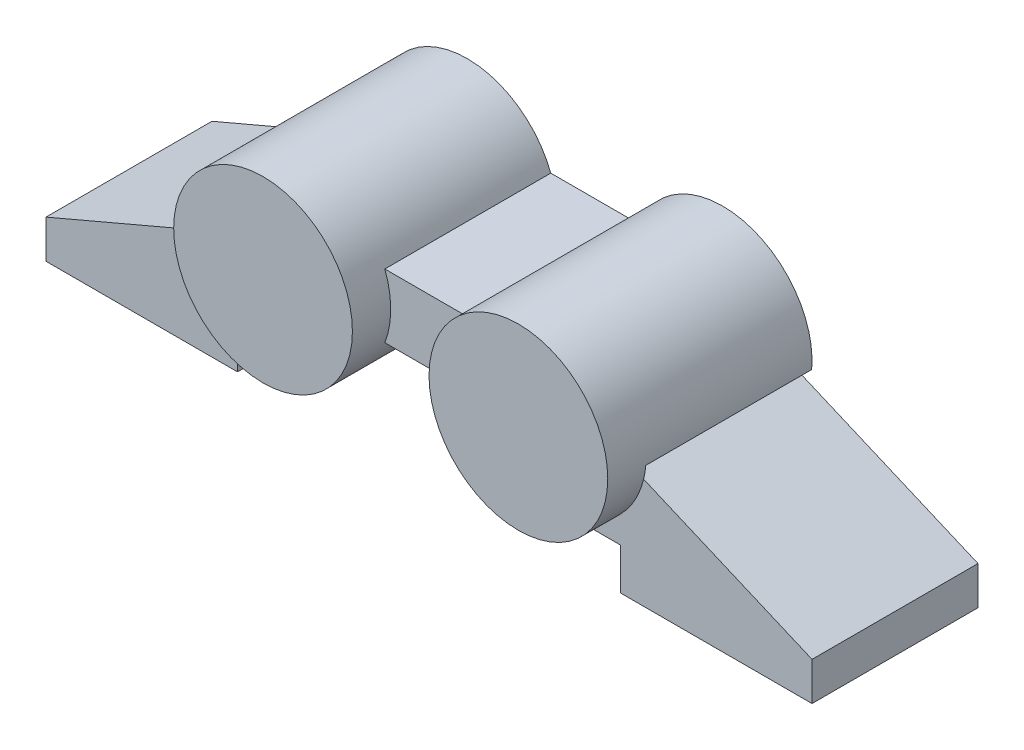
ISO-10303-21;
HEADER;
FILE_DESCRIPTION(('STEP AP214'),'2;1');
FILE_NAME('part.step','',(''),(''),'','','');
FILE_SCHEMA(('AUTOMOTIVE_DESIGN { 1 0 10303 214 1 1 1 1 }'));
ENDSEC;
DATA;
#1=APPLICATION_CONTEXT('core data for automotive mechanical design processes');
#2=APPLICATION_PROTOCOL_DEFINITION('international standard','automotive_design',2000,#1);
#3=PRODUCT_CONTEXT('',#1,'mechanical');
#4=PRODUCT('Part','Part','',(#3));
#5=PRODUCT_RELATED_PRODUCT_CATEGORY('part','',(#4));
#6=PRODUCT_DEFINITION_FORMATION('','',#4);
#7=PRODUCT_DEFINITION_CONTEXT('part definition',#1,'design');
#8=PRODUCT_DEFINITION('design','',#6,#7);
#9=PRODUCT_DEFINITION_SHAPE('','',#8);
#10=(LENGTH_UNIT() NAMED_UNIT(*) SI_UNIT(.MILLI.,.METRE.));
#11=(NAMED_UNIT(*) PLANE_ANGLE_UNIT() SI_UNIT($,.RADIAN.));
#12=(NAMED_UNIT(*) SI_UNIT($,.STERADIAN.) SOLID_ANGLE_UNIT());
#13=UNCERTAINTY_MEASURE_WITH_UNIT(LENGTH_MEASURE(1.E-05),#10,'distance_accuracy_value','');
#14=(GEOMETRIC_REPRESENTATION_CONTEXT(3) GLOBAL_UNCERTAINTY_ASSIGNED_CONTEXT((#13)) GLOBAL_UNIT_ASSIGNED_CONTEXT((#10,
#11,#12)) REPRESENTATION_CONTEXT('',''));
#15=CARTESIAN_POINT('',(0.,0.,0.));
#16=DIRECTION('',(0.,0.,1.));
#17=DIRECTION('',(1.,0.,0.));
#18=AXIS2_PLACEMENT_3D('',#15,#16,#17);
#19=CARTESIAN_POINT('',(10.,-7.5,13.));
#20=DIRECTION('',(0.,0.,-1.));
#21=DIRECTION('',(-1.,0.,0.));
#22=AXIS2_PLACEMENT_3D('',#19,#20,#21);
#23=CYLINDRICAL_SURFACE('',#22,7.);
#24=CARTESIAN_POINT('',(10.,-7.5,16.));
#25=DIRECTION('',(0.,0.,1.));
#26=DIRECTION('',(1.,0.,0.));
#27=AXIS2_PLACEMENT_3D('',#24,#25,#26);
#28=CIRCLE('',#27,7.);
#29=CARTESIAN_POINT('',(17.,-7.5,16.));
#30=VERTEX_POINT('',#29);
#31=EDGE_CURVE('E139',#30,#30,#28,.T.);
#32=ORIENTED_EDGE('',*,*,#31,.F.);
#33=EDGE_LOOP('',(#32));
#34=FACE_BOUND('',#33,.T.);
#35=DIRECTION('',(0.,0.,-1.));
#36=VECTOR('',#35,1.);
#37=CARTESIAN_POINT('',(16.9735909380194,-8.10747792484496,13.));
#38=LINE('',#37,#36);
#39=CARTESIAN_POINT('',(16.9735909380194,-8.10747792484496,0.));
#40=VERTEX_POINT('',#39);
#41=CARTESIAN_POINT('',(16.9735909380194,-8.10747792484496,13.));
#42=VERTEX_POINT('',#41);
#43=EDGE_CURVE('E180',#40,#42,#38,.F.);
#44=ORIENTED_EDGE('',*,*,#43,.F.);
#45=CARTESIAN_POINT('',(10.,-7.5,0.));
#46=DIRECTION('',(0.,0.,1.));
#47=DIRECTION('',(1.,0.,0.));
#48=AXIS2_PLACEMENT_3D('',#45,#46,#47);
#49=CIRCLE('',#48,7.);
#50=CARTESIAN_POINT('',(3.46165158468899,-5.,0.));
#51=VERTEX_POINT('',#50);
#52=EDGE_CURVE('E138',#40,#51,#49,.T.);
#53=ORIENTED_EDGE('',*,*,#52,.T.);
#54=DIRECTION('',(0.,0.,-1.));
#55=VECTOR('',#54,1.);
#56=CARTESIAN_POINT('',(3.46165158468899,-5.,13.));
#57=LINE('',#56,#55);
#58=CARTESIAN_POINT('',(3.46165158468899,-5.,13.));
#59=VERTEX_POINT('',#58);
#60=EDGE_CURVE('E162',#59,#51,#57,.T.);
#61=ORIENTED_EDGE('',*,*,#60,.F.);
#62=CARTESIAN_POINT('',(10.,-7.5,13.));
#63=DIRECTION('',(0.,0.,1.));
#64=DIRECTION('',(1.,0.,0.));
#65=AXIS2_PLACEMENT_3D('',#62,#63,#64);
#66=CIRCLE('',#65,7.);
#67=CARTESIAN_POINT('',(3.46165158468899,-10.,13.));
#68=VERTEX_POINT('',#67);
#69=EDGE_CURVE('E173',#59,#68,#66,.T.);
#70=ORIENTED_EDGE('',*,*,#69,.T.);
#71=DIRECTION('',(0.,0.,-1.));
#72=VECTOR('',#71,1.);
#73=CARTESIAN_POINT('',(3.46165158468899,-10.,13.));
#74=LINE('',#73,#72);
#75=CARTESIAN_POINT('',(3.46165158468899,-10.,0.));
#76=VERTEX_POINT('',#75);
#77=EDGE_CURVE('E96',#68,#76,#74,.T.);
#78=ORIENTED_EDGE('',*,*,#77,.T.);
#79=CARTESIAN_POINT('',(10.,-14.5,0.));
#80=VERTEX_POINT('',#79);
#81=EDGE_CURVE('E142',#76,#80,#49,.T.);
#82=ORIENTED_EDGE('',*,*,#81,.T.);
#83=DIRECTION('',(0.,0.,-1.));
#84=VECTOR('',#83,1.);
#85=CARTESIAN_POINT('',(10.,-14.5,13.));
#86=LINE('',#85,#84);
#87=CARTESIAN_POINT('',(10.,-14.5,13.));
#88=VERTEX_POINT('',#87);
#89=EDGE_CURVE('E158',#88,#80,#86,.T.);
#90=ORIENTED_EDGE('',*,*,#89,.F.);
#91=CARTESIAN_POINT('',(16.8089171951131,-9.12439115673941,13.));
#92=VERTEX_POINT('',#91);
#93=EDGE_CURVE('E164',#88,#92,#66,.T.);
#94=ORIENTED_EDGE('',*,*,#93,.T.);
#95=CARTESIAN_POINT('',(10.,-7.5,13.));
#96=DIRECTION('',(0.,0.,1.));
#97=DIRECTION('',(1.,0.,0.));
#98=AXIS2_PLACEMENT_3D('',#95,#96,#97);
#99=CIRCLE('',#98,7.);
#100=EDGE_CURVE('E11',#92,#42,#99,.T.);
#101=ORIENTED_EDGE('',*,*,#100,.T.);
#102=EDGE_LOOP('',(#44,#53,#61,#70,#78,#82,#90,#94,#101));
#103=FACE_BOUND('',#102,.T.);
#104=ADVANCED_FACE('F34',(#34,#103),#23,.T.);
#105=CARTESIAN_POINT('',(0.,0.,13.));
#106=DIRECTION('',(0.,0.,1.));
#107=DIRECTION('',(1.,0.,0.));
#108=AXIS2_PLACEMENT_3D('',#105,#106,#107);
#109=PLANE('',#108);
#110=ORIENTED_EDGE('',*,*,#69,.F.);
#111=DIRECTION('',(1.,0.,0.));
#112=VECTOR('',#111,1.);
#113=CARTESIAN_POINT('',(0.,-5.,13.));
#114=LINE('',#113,#112);
#115=CARTESIAN_POINT('',(-3.46165158468899,-5.,13.));
#116=VERTEX_POINT('',#115);
#117=EDGE_CURVE('E379',#116,#59,#114,.T.);
#118=ORIENTED_EDGE('',*,*,#117,.F.);
#119=CARTESIAN_POINT('',(-10.,-7.5,13.));
#120=DIRECTION('',(0.,0.,-1.));
#121=DIRECTION('',(-1.,0.,0.));
#122=AXIS2_PLACEMENT_3D('',#119,#120,#121);
#123=CIRCLE('',#122,7.);
#124=CARTESIAN_POINT('',(-3.46165158468899,-10.,13.));
#125=VERTEX_POINT('',#124);
#126=EDGE_CURVE('E265',#116,#125,#123,.T.);
#127=ORIENTED_EDGE('',*,*,#126,.T.);
#128=DIRECTION('',(-1.,0.,0.));
#129=VECTOR('',#128,1.);
#130=CARTESIAN_POINT('',(0.,-10.,13.));
#131=LINE('',#130,#129);
#132=EDGE_CURVE('E383',#68,#125,#131,.T.);
#133=ORIENTED_EDGE('',*,*,#132,.F.);
#134=EDGE_LOOP('',(#110,#118,#127,#133));
#135=FACE_BOUND('',#134,.T.);
#136=ADVANCED_FACE('F386',(#135),#109,.T.);
#137=CARTESIAN_POINT('',(-0.705763952424521,-1.65489478499543,13.));
#138=DIRECTION('',(-0.392286095348589,-0.919843258058762,0.));
#139=DIRECTION('',(0.919843258058762,-0.392286095348589,0.));
#140=AXIS2_PLACEMENT_3D('',#137,#138,#139);
#141=PLANE('',#140);
#142=DIRECTION('',(-0.919843258058762,0.392286095348589,0.));
#143=VECTOR('',#142,1.);
#144=CARTESIAN_POINT('',(-0.705763952424521,-1.65489478499543,0.));
#145=LINE('',#144,#143);
#146=CARTESIAN_POINT('',(30.,-14.75,0.));
#147=VERTEX_POINT('',#146);
#148=CARTESIAN_POINT('',(13.,-7.5,0.));
#149=VERTEX_POINT('',#148);
#150=EDGE_CURVE('E135',#147,#149,#145,.T.);
#151=ORIENTED_EDGE('',*,*,#150,.T.);
#152=DIRECTION('',(0.,0.,-1.));
#153=VECTOR('',#152,1.);
#154=CARTESIAN_POINT('',(13.,-7.5,13.));
#155=LINE('',#154,#153);
#156=CARTESIAN_POINT('',(13.,-7.5,13.));
#157=VERTEX_POINT('',#156);
#158=EDGE_CURVE('E184',#157,#149,#155,.T.);
#159=ORIENTED_EDGE('',*,*,#158,.F.);
#160=DIRECTION('',(-0.919843258058761,0.39228609534859,0.));
#161=VECTOR('',#160,1.);
#162=CARTESIAN_POINT('',(-0.705763952424519,-1.65489478499542,13.));
#163=LINE('',#162,#161);
#164=EDGE_CURVE('E198',#92,#157,#163,.T.);
#165=ORIENTED_EDGE('',*,*,#164,.F.);
#166=DIRECTION('',(-0.919843258058762,0.392286095348589,0.));
#167=VECTOR('',#166,1.);
#168=CARTESIAN_POINT('',(-0.705763952424521,-1.65489478499543,13.));
#169=LINE('',#168,#167);
#170=CARTESIAN_POINT('',(30.,-14.75,13.));
#171=VERTEX_POINT('',#170);
#172=EDGE_CURVE('E154',#171,#92,#169,.T.);
#173=ORIENTED_EDGE('',*,*,#172,.F.);
#174=DIRECTION('',(0.,0.,-1.));
#175=VECTOR('',#174,1.);
#176=CARTESIAN_POINT('',(30.,-14.75,13.));
#177=LINE('',#176,#175);
#178=EDGE_CURVE('E131',#171,#147,#177,.T.);
#179=ORIENTED_EDGE('',*,*,#178,.T.);
#180=EDGE_LOOP('',(#151,#159,#165,#173,#179));
#181=FACE_BOUND('',#180,.T.);
#182=ADVANCED_FACE('F36',(#181),#141,.F.);
#183=CARTESIAN_POINT('',(0.,-5.,13.));
#184=DIRECTION('',(0.,1.,0.));
#185=DIRECTION('',(0.,0.,1.));
#186=AXIS2_PLACEMENT_3D('',#183,#184,#185);
#187=PLANE('',#186);
#188=DIRECTION('',(1.,0.,0.));
#189=VECTOR('',#188,1.);
#190=CARTESIAN_POINT('',(0.,-5.,0.));
#191=LINE('',#190,#189);
#192=CARTESIAN_POINT('',(-3.46165158468899,-5.,0.));
#193=VERTEX_POINT('',#192);
#194=EDGE_CURVE('E141',#193,#51,#191,.T.);
#195=ORIENTED_EDGE('',*,*,#194,.F.);
#196=DIRECTION('',(0.,0.,-1.));
#197=VECTOR('',#196,1.);
#198=CARTESIAN_POINT('',(-3.46165158468899,-5.,13.));
#199=LINE('',#198,#197);
#200=EDGE_CURVE('E209',#116,#193,#199,.T.);
#201=ORIENTED_EDGE('',*,*,#200,.F.);
#202=ORIENTED_EDGE('',*,*,#117,.T.);
#203=ORIENTED_EDGE('',*,*,#60,.T.);
#204=EDGE_LOOP('',(#195,#201,#202,#203));
#205=FACE_BOUND('',#204,.T.);
#206=ADVANCED_FACE('F380',(#205),#187,.T.);
#207=CARTESIAN_POINT('',(0.,-10.,13.));
#208=DIRECTION('',(0.,-1.,0.));
#209=DIRECTION('',(0.,0.,-1.));
#210=AXIS2_PLACEMENT_3D('',#207,#208,#209);
#211=PLANE('',#210);
#212=DIRECTION('',(-1.,0.,0.));
#213=VECTOR('',#212,1.);
#214=CARTESIAN_POINT('',(0.,-10.,0.));
#215=LINE('',#214,#213);
#216=CARTESIAN_POINT('',(-3.46165158468899,-10.,0.));
#217=VERTEX_POINT('',#216);
#218=EDGE_CURVE('E145',#76,#217,#215,.T.);
#219=ORIENTED_EDGE('',*,*,#218,.F.);
#220=ORIENTED_EDGE('',*,*,#77,.F.);
#221=ORIENTED_EDGE('',*,*,#132,.T.);
#222=DIRECTION('',(0.,0.,-1.));
#223=VECTOR('',#222,1.);
#224=CARTESIAN_POINT('',(-3.46165158468899,-10.,13.));
#225=LINE('',#224,#223);
#226=EDGE_CURVE('E212',#125,#217,#225,.T.);
#227=ORIENTED_EDGE('',*,*,#226,.T.);
#228=EDGE_LOOP('',(#219,#220,#221,#227));
#229=FACE_BOUND('',#228,.T.);
#230=ADVANCED_FACE('F402',(#229),#211,.T.);
#231=CARTESIAN_POINT('',(0.,-14.5,13.));
#232=DIRECTION('',(0.,1.,0.));
#233=DIRECTION('',(0.,0.,1.));
#234=AXIS2_PLACEMENT_3D('',#231,#232,#233);
#235=PLANE('',#234);
#236=DIRECTION('',(1.,0.,0.));
#237=VECTOR('',#236,1.);
#238=CARTESIAN_POINT('',(0.,-14.5,0.));
#239=LINE('',#238,#237);
#240=CARTESIAN_POINT('',(15.,-14.5,0.));
#241=VERTEX_POINT('',#240);
#242=EDGE_CURVE('E148',#80,#241,#239,.T.);
#243=ORIENTED_EDGE('',*,*,#242,.T.);
#244=DIRECTION('',(0.,0.,-1.));
#245=VECTOR('',#244,1.);
#246=CARTESIAN_POINT('',(15.,-14.5,13.));
#247=LINE('',#246,#245);
#248=CARTESIAN_POINT('',(15.,-14.5,13.));
#249=VERTEX_POINT('',#248);
#250=EDGE_CURVE('E126',#249,#241,#247,.T.);
#251=ORIENTED_EDGE('',*,*,#250,.F.);
#252=DIRECTION('',(1.,0.,0.));
#253=VECTOR('',#252,1.);
#254=CARTESIAN_POINT('',(0.,-14.5,13.));
#255=LINE('',#254,#253);
#256=EDGE_CURVE('E114',#88,#249,#255,.T.);
#257=ORIENTED_EDGE('',*,*,#256,.F.);
#258=ORIENTED_EDGE('',*,*,#89,.T.);
#259=EDGE_LOOP('',(#243,#251,#257,#258));
#260=FACE_BOUND('',#259,.T.);
#261=ADVANCED_FACE('F406',(#260),#235,.F.);
#262=CARTESIAN_POINT('',(15.,0.,13.));
#263=DIRECTION('',(1.,0.,0.));
#264=DIRECTION('',(0.,0.,-1.));
#265=AXIS2_PLACEMENT_3D('',#262,#263,#264);
#266=PLANE('',#265);
#267=DIRECTION('',(0.,-1.,0.));
#268=VECTOR('',#267,1.);
#269=CARTESIAN_POINT('',(15.,0.,0.));
#270=LINE('',#269,#268);
#271=CARTESIAN_POINT('',(15.,-17.75,0.));
#272=VERTEX_POINT('',#271);
#273=EDGE_CURVE('E123',#241,#272,#270,.T.);
#274=ORIENTED_EDGE('',*,*,#273,.T.);
#275=DIRECTION('',(0.,0.,-1.));
#276=VECTOR('',#275,1.);
#277=CARTESIAN_POINT('',(15.,-17.75,13.));
#278=LINE('',#277,#276);
#279=CARTESIAN_POINT('',(15.,-17.75,13.));
#280=VERTEX_POINT('',#279);
#281=EDGE_CURVE('E120',#280,#272,#278,.T.);
#282=ORIENTED_EDGE('',*,*,#281,.F.);
#283=DIRECTION('',(0.,-1.,0.));
#284=VECTOR('',#283,1.);
#285=CARTESIAN_POINT('',(15.,0.,13.));
#286=LINE('',#285,#284);
#287=EDGE_CURVE('E107',#249,#280,#286,.T.);
#288=ORIENTED_EDGE('',*,*,#287,.F.);
#289=ORIENTED_EDGE('',*,*,#250,.T.);
#290=EDGE_LOOP('',(#274,#282,#288,#289));
#291=FACE_BOUND('',#290,.T.);
#292=ADVANCED_FACE('F121',(#291),#266,.F.);
#293=CARTESIAN_POINT('',(0.,-17.75,13.));
#294=DIRECTION('',(0.,1.,0.));
#295=DIRECTION('',(-1.,0.,0.));
#296=AXIS2_PLACEMENT_3D('',#293,#294,#295);
#297=PLANE('',#296);
#298=DIRECTION('',(1.,0.,0.));
#299=VECTOR('',#298,1.);
#300=CARTESIAN_POINT('',(0.,-17.75,0.));
#301=LINE('',#300,#299);
#302=CARTESIAN_POINT('',(30.,-17.75,0.));
#303=VERTEX_POINT('',#302);
#304=EDGE_CURVE('E151',#272,#303,#301,.T.);
#305=ORIENTED_EDGE('',*,*,#304,.T.);
#306=DIRECTION('',(0.,0.,-1.));
#307=VECTOR('',#306,1.);
#308=CARTESIAN_POINT('',(30.,-17.75,13.));
#309=LINE('',#308,#307);
#310=CARTESIAN_POINT('',(30.,-17.75,13.));
#311=VERTEX_POINT('',#310);
#312=EDGE_CURVE('E127',#311,#303,#309,.T.);
#313=ORIENTED_EDGE('',*,*,#312,.F.);
#314=DIRECTION('',(1.,0.,0.));
#315=VECTOR('',#314,1.);
#316=CARTESIAN_POINT('',(0.,-17.75,13.));
#317=LINE('',#316,#315);
#318=EDGE_CURVE('E111',#280,#311,#317,.T.);
#319=ORIENTED_EDGE('',*,*,#318,.F.);
#320=ORIENTED_EDGE('',*,*,#281,.T.);
#321=EDGE_LOOP('',(#305,#313,#319,#320));
#322=FACE_BOUND('',#321,.T.);
#323=ADVANCED_FACE('F129',(#322),#297,.F.);
#324=CARTESIAN_POINT('',(30.,0.,13.));
#325=DIRECTION('',(-1.,0.,0.));
#326=DIRECTION('',(0.,0.,1.));
#327=AXIS2_PLACEMENT_3D('',#324,#325,#326);
#328=PLANE('',#327);
#329=DIRECTION('',(0.,1.,0.));
#330=VECTOR('',#329,1.);
#331=CARTESIAN_POINT('',(30.,0.,0.));
#332=LINE('',#331,#330);
#333=EDGE_CURVE('E88',#303,#147,#332,.T.);
#334=ORIENTED_EDGE('',*,*,#333,.T.);
#335=ORIENTED_EDGE('',*,*,#178,.F.);
#336=DIRECTION('',(0.,1.,0.));
#337=VECTOR('',#336,1.);
#338=CARTESIAN_POINT('',(30.,0.,13.));
#339=LINE('',#338,#337);
#340=EDGE_CURVE('E58',#311,#171,#339,.T.);
#341=ORIENTED_EDGE('',*,*,#340,.F.);
#342=ORIENTED_EDGE('',*,*,#312,.T.);
#343=EDGE_LOOP('',(#334,#335,#341,#342));
#344=FACE_BOUND('',#343,.T.);
#345=ADVANCED_FACE('F407',(#344),#328,.F.);
#346=ORIENTED_EDGE('',*,*,#93,.F.);
#347=ORIENTED_EDGE('',*,*,#256,.T.);
#348=ORIENTED_EDGE('',*,*,#287,.T.);
#349=ORIENTED_EDGE('',*,*,#318,.T.);
#350=ORIENTED_EDGE('',*,*,#340,.T.);
#351=ORIENTED_EDGE('',*,*,#172,.T.);
#352=EDGE_LOOP('',(#346,#347,#348,#349,#350,#351));
#353=FACE_BOUND('',#352,.T.);
#354=ADVANCED_FACE('F109',(#353),#109,.T.);
#355=CARTESIAN_POINT('',(0.,0.,0.));
#356=DIRECTION('',(0.,0.,1.));
#357=DIRECTION('',(1.,0.,0.));
#358=AXIS2_PLACEMENT_3D('',#355,#356,#357);
#359=PLANE('',#358);
#360=CARTESIAN_POINT('',(10.,-7.5,0.));
#361=DIRECTION('',(0.,0.,1.));
#362=DIRECTION('',(1.,0.,0.));
#363=AXIS2_PLACEMENT_3D('',#360,#361,#362);
#364=CIRCLE('',#363,3.);
#365=CARTESIAN_POINT('',(12.7527733174211,-6.30742335135451,0.));
#366=VERTEX_POINT('',#365);
#367=EDGE_CURVE('E49',#366,#149,#364,.T.);
#368=ORIENTED_EDGE('',*,*,#367,.T.);
#369=ORIENTED_EDGE('',*,*,#150,.F.);
#370=ORIENTED_EDGE('',*,*,#333,.F.);
#371=ORIENTED_EDGE('',*,*,#304,.F.);
#372=ORIENTED_EDGE('',*,*,#273,.F.);
#373=ORIENTED_EDGE('',*,*,#242,.F.);
#374=ORIENTED_EDGE('',*,*,#81,.F.);
#375=ORIENTED_EDGE('',*,*,#218,.T.);
#376=CARTESIAN_POINT('',(-10.,-7.5,0.));
#377=DIRECTION('',(0.,0.,-1.));
#378=DIRECTION('',(-1.,0.,0.));
#379=AXIS2_PLACEMENT_3D('',#376,#377,#378);
#380=CIRCLE('',#379,7.);
#381=CARTESIAN_POINT('',(-10.,-14.5,0.));
#382=VERTEX_POINT('',#381);
#383=EDGE_CURVE('E244',#217,#382,#380,.T.);
#384=ORIENTED_EDGE('',*,*,#383,.T.);
#385=DIRECTION('',(-1.,0.,0.));
#386=VECTOR('',#385,1.);
#387=CARTESIAN_POINT('',(0.,-14.5,0.));
#388=LINE('',#387,#386);
#389=CARTESIAN_POINT('',(-15.,-14.5,0.));
#390=VERTEX_POINT('',#389);
#391=EDGE_CURVE('E241',#382,#390,#388,.T.);
#392=ORIENTED_EDGE('',*,*,#391,.T.);
#393=DIRECTION('',(0.,-1.,0.));
#394=VECTOR('',#393,1.);
#395=CARTESIAN_POINT('',(-15.,0.,0.));
#396=LINE('',#395,#394);
#397=CARTESIAN_POINT('',(-15.,-17.75,0.));
#398=VERTEX_POINT('',#397);
#399=EDGE_CURVE('E238',#390,#398,#396,.T.);
#400=ORIENTED_EDGE('',*,*,#399,.T.);
#401=DIRECTION('',(-1.,0.,0.));
#402=VECTOR('',#401,1.);
#403=CARTESIAN_POINT('',(0.,-17.75,0.));
#404=LINE('',#403,#402);
#405=CARTESIAN_POINT('',(-30.,-17.75,0.));
#406=VERTEX_POINT('',#405);
#407=EDGE_CURVE('E235',#398,#406,#404,.T.);
#408=ORIENTED_EDGE('',*,*,#407,.T.);
#409=DIRECTION('',(0.,1.,0.));
#410=VECTOR('',#409,1.);
#411=CARTESIAN_POINT('',(-30.,0.,0.));
#412=LINE('',#411,#410);
#413=CARTESIAN_POINT('',(-30.,-14.75,0.));
#414=VERTEX_POINT('',#413);
#415=EDGE_CURVE('E231',#406,#414,#412,.T.);
#416=ORIENTED_EDGE('',*,*,#415,.T.);
#417=DIRECTION('',(0.919843258058762,0.392286095348589,0.));
#418=VECTOR('',#417,1.);
#419=CARTESIAN_POINT('',(0.705763952424521,-1.65489478499543,0.));
#420=LINE('',#419,#418);
#421=CARTESIAN_POINT('',(-13.,-7.5,0.));
#422=VERTEX_POINT('',#421);
#423=EDGE_CURVE('E248',#414,#422,#420,.T.);
#424=ORIENTED_EDGE('',*,*,#423,.T.);
#425=CARTESIAN_POINT('',(-10.,-7.5,0.));
#426=DIRECTION('',(0.,0.,-1.));
#427=DIRECTION('',(-1.,0.,0.));
#428=AXIS2_PLACEMENT_3D('',#425,#426,#427);
#429=CIRCLE('',#428,3.);
#430=CARTESIAN_POINT('',(-12.7527733174211,-6.30742335135451,0.));
#431=VERTEX_POINT('',#430);
#432=EDGE_CURVE('E280',#431,#422,#429,.T.);
#433=ORIENTED_EDGE('',*,*,#432,.F.);
#434=DIRECTION('',(-0.919843258058762,-0.392286095348589,0.));
#435=VECTOR('',#434,1.);
#436=CARTESIAN_POINT('',(0.313477857075932,-0.735051526936668,0.));
#437=LINE('',#436,#435);
#438=CARTESIAN_POINT('',(-16.9735909380194,-8.10747792484496,0.));
#439=VERTEX_POINT('',#438);
#440=EDGE_CURVE('E205',#431,#439,#437,.T.);
#441=ORIENTED_EDGE('',*,*,#440,.T.);
#442=EDGE_CURVE('E245',#439,#193,#380,.T.);
#443=ORIENTED_EDGE('',*,*,#442,.T.);
#444=ORIENTED_EDGE('',*,*,#194,.T.);
#445=ORIENTED_EDGE('',*,*,#52,.F.);
#446=DIRECTION('',(0.919843258058762,-0.392286095348589,0.));
#447=VECTOR('',#446,1.);
#448=CARTESIAN_POINT('',(-0.313477857075932,-0.735051526936668,0.));
#449=LINE('',#448,#447);
#450=EDGE_CURVE('E42',#366,#40,#449,.T.);
#451=ORIENTED_EDGE('',*,*,#450,.F.);
#452=EDGE_LOOP('',(#368,#369,#370,#371,#372,#373,#374,#375,#384,#392,#400,#408,#416,#424,#433,
#441,#443,#444,#445,#451));
#453=FACE_BOUND('',#452,.T.);
#454=ADVANCED_FACE('F398',(#453),#359,.F.);
#455=CARTESIAN_POINT('',(10.,-7.5,16.));
#456=DIRECTION('',(0.,0.,1.));
#457=DIRECTION('',(1.,0.,0.));
#458=AXIS2_PLACEMENT_3D('',#455,#456,#457);
#459=PLANE('',#458);
#460=ORIENTED_EDGE('',*,*,#31,.T.);
#461=EDGE_LOOP('',(#460));
#462=FACE_BOUND('',#461,.T.);
#463=ADVANCED_FACE('F468',(#462),#459,.T.);
#464=CARTESIAN_POINT('',(0.,0.,13.));
#465=DIRECTION('',(0.,0.,1.));
#466=DIRECTION('',(1.,0.,0.));
#467=AXIS2_PLACEMENT_3D('',#464,#465,#466);
#468=PLANE('',#467);
#469=ORIENTED_EDGE('',*,*,#164,.T.);
#470=CARTESIAN_POINT('',(10.,-7.5,13.));
#471=DIRECTION('',(0.,0.,1.));
#472=DIRECTION('',(1.,0.,0.));
#473=AXIS2_PLACEMENT_3D('',#470,#471,#472);
#474=CIRCLE('',#473,3.);
#475=CARTESIAN_POINT('',(12.7527733174211,-6.30742335135451,13.));
#476=VERTEX_POINT('',#475);
#477=EDGE_CURVE('E195',#476,#157,#474,.T.);
#478=ORIENTED_EDGE('',*,*,#477,.F.);
#479=DIRECTION('',(-0.919843258058762,0.392286095348589,0.));
#480=VECTOR('',#479,1.);
#481=CARTESIAN_POINT('',(-0.313477857075932,-0.735051526936668,13.));
#482=LINE('',#481,#480);
#483=EDGE_CURVE('E193',#42,#476,#482,.T.);
#484=ORIENTED_EDGE('',*,*,#483,.F.);
#485=ORIENTED_EDGE('',*,*,#100,.F.);
#486=EDGE_LOOP('',(#469,#478,#484,#485));
#487=FACE_BOUND('',#486,.T.);
#488=ADVANCED_FACE('F396',(#487),#468,.F.);
#489=CARTESIAN_POINT('',(-0.313477857075932,-0.735051526936668,13.));
#490=DIRECTION('',(-0.392286095348589,-0.919843258058762,0.));
#491=DIRECTION('',(0.919843258058762,-0.392286095348589,0.));
#492=AXIS2_PLACEMENT_3D('',#489,#490,#491);
#493=PLANE('',#492);
#494=ORIENTED_EDGE('',*,*,#43,.T.);
#495=ORIENTED_EDGE('',*,*,#483,.T.);
#496=DIRECTION('',(0.,0.,-1.));
#497=VECTOR('',#496,1.);
#498=CARTESIAN_POINT('',(12.7527733174211,-6.30742335135451,13.));
#499=LINE('',#498,#497);
#500=EDGE_CURVE('E189',#476,#366,#499,.T.);
#501=ORIENTED_EDGE('',*,*,#500,.T.);
#502=ORIENTED_EDGE('',*,*,#450,.T.);
#503=EDGE_LOOP('',(#494,#495,#501,#502));
#504=FACE_BOUND('',#503,.T.);
#505=ADVANCED_FACE('F584',(#504),#493,.T.);
#506=CARTESIAN_POINT('',(10.,-7.5,13.));
#507=DIRECTION('',(0.,0.,-1.));
#508=DIRECTION('',(-1.,0.,0.));
#509=AXIS2_PLACEMENT_3D('',#506,#507,#508);
#510=CYLINDRICAL_SURFACE('',#509,3.);
#511=ORIENTED_EDGE('',*,*,#367,.F.);
#512=ORIENTED_EDGE('',*,*,#500,.F.);
#513=ORIENTED_EDGE('',*,*,#477,.T.);
#514=ORIENTED_EDGE('',*,*,#158,.T.);
#515=EDGE_LOOP('',(#511,#512,#513,#514));
#516=FACE_BOUND('',#515,.T.);
#517=ADVANCED_FACE('F479',(#516),#510,.F.);
#518=CARTESIAN_POINT('',(-10.,-7.5,13.));
#519=DIRECTION('',(0.,0.,-1.));
#520=DIRECTION('',(1.,0.,0.));
#521=AXIS2_PLACEMENT_3D('',#518,#519,#520);
#522=CYLINDRICAL_SURFACE('',#521,7.);
#523=CARTESIAN_POINT('',(-10.,-7.5,16.));
#524=DIRECTION('',(0.,0.,-1.));
#525=DIRECTION('',(-1.,0.,0.));
#526=AXIS2_PLACEMENT_3D('',#523,#524,#525);
#527=CIRCLE('',#526,7.);
#528=CARTESIAN_POINT('',(-17.,-7.5,16.));
#529=VERTEX_POINT('',#528);
#530=EDGE_CURVE('E251',#529,#529,#527,.T.);
#531=ORIENTED_EDGE('',*,*,#530,.T.);
#532=EDGE_LOOP('',(#531));
#533=FACE_BOUND('',#532,.T.);
#534=DIRECTION('',(0.,0.,-1.));
#535=VECTOR('',#534,1.);
#536=CARTESIAN_POINT('',(-16.9735909380194,-8.10747792484496,13.));
#537=LINE('',#536,#535);
#538=CARTESIAN_POINT('',(-16.9735909380194,-8.10747792484496,13.));
#539=VERTEX_POINT('',#538);
#540=EDGE_CURVE('E268',#439,#539,#537,.F.);
#541=ORIENTED_EDGE('',*,*,#540,.T.);
#542=CARTESIAN_POINT('',(-10.,-7.5,13.));
#543=DIRECTION('',(0.,0.,-1.));
#544=DIRECTION('',(-1.,0.,0.));
#545=AXIS2_PLACEMENT_3D('',#542,#543,#544);
#546=CIRCLE('',#545,7.);
#547=CARTESIAN_POINT('',(-16.8089171951131,-9.12439115673941,13.));
#548=VERTEX_POINT('',#547);
#549=EDGE_CURVE('E196',#548,#539,#546,.T.);
#550=ORIENTED_EDGE('',*,*,#549,.F.);
#551=CARTESIAN_POINT('',(-10.,-14.5,13.));
#552=VERTEX_POINT('',#551);
#553=EDGE_CURVE('E208',#552,#548,#123,.T.);
#554=ORIENTED_EDGE('',*,*,#553,.F.);
#555=DIRECTION('',(0.,0.,-1.));
#556=VECTOR('',#555,1.);
#557=CARTESIAN_POINT('',(-10.,-14.5,13.));
#558=LINE('',#557,#556);
#559=EDGE_CURVE('E215',#552,#382,#558,.T.);
#560=ORIENTED_EDGE('',*,*,#559,.T.);
#561=ORIENTED_EDGE('',*,*,#383,.F.);
#562=ORIENTED_EDGE('',*,*,#226,.F.);
#563=ORIENTED_EDGE('',*,*,#126,.F.);
#564=ORIENTED_EDGE('',*,*,#200,.T.);
#565=ORIENTED_EDGE('',*,*,#442,.F.);
#566=EDGE_LOOP('',(#541,#550,#554,#560,#561,#562,#563,#564,#565));
#567=FACE_BOUND('',#566,.T.);
#568=ADVANCED_FACE('F322',(#533,#567),#522,.T.);
#569=CARTESIAN_POINT('',(0.705763952424521,-1.65489478499543,13.));
#570=DIRECTION('',(0.392286095348589,-0.919843258058762,0.));
#571=DIRECTION('',(-0.919843258058762,-0.392286095348589,0.));
#572=AXIS2_PLACEMENT_3D('',#569,#570,#571);
#573=PLANE('',#572);
#574=ORIENTED_EDGE('',*,*,#423,.F.);
#575=DIRECTION('',(0.,0.,-1.));
#576=VECTOR('',#575,1.);
#577=CARTESIAN_POINT('',(-30.,-14.75,13.));
#578=LINE('',#577,#576);
#579=CARTESIAN_POINT('',(-30.,-14.75,13.));
#580=VERTEX_POINT('',#579);
#581=EDGE_CURVE('E227',#580,#414,#578,.T.);
#582=ORIENTED_EDGE('',*,*,#581,.F.);
#583=DIRECTION('',(0.919843258058762,0.392286095348589,0.));
#584=VECTOR('',#583,1.);
#585=CARTESIAN_POINT('',(0.705763952424521,-1.65489478499543,13.));
#586=LINE('',#585,#584);
#587=EDGE_CURVE('E234',#580,#548,#586,.T.);
#588=ORIENTED_EDGE('',*,*,#587,.T.);
#589=DIRECTION('',(0.919843258058761,0.39228609534859,0.));
#590=VECTOR('',#589,1.);
#591=CARTESIAN_POINT('',(0.705763952424519,-1.65489478499542,13.));
#592=LINE('',#591,#590);
#593=CARTESIAN_POINT('',(-13.,-7.5,13.));
#594=VERTEX_POINT('',#593);
#595=EDGE_CURVE('E286',#548,#594,#592,.T.);
#596=ORIENTED_EDGE('',*,*,#595,.T.);
#597=DIRECTION('',(0.,0.,-1.));
#598=VECTOR('',#597,1.);
#599=CARTESIAN_POINT('',(-13.,-7.5,13.));
#600=LINE('',#599,#598);
#601=EDGE_CURVE('E273',#594,#422,#600,.T.);
#602=ORIENTED_EDGE('',*,*,#601,.T.);
#603=EDGE_LOOP('',(#574,#582,#588,#596,#602));
#604=FACE_BOUND('',#603,.T.);
#605=ADVANCED_FACE('F306',(#604),#573,.F.);
#606=CARTESIAN_POINT('',(0.,-14.5,13.));
#607=DIRECTION('',(0.,1.,0.));
#608=DIRECTION('',(0.,0.,1.));
#609=AXIS2_PLACEMENT_3D('',#606,#607,#608);
#610=PLANE('',#609);
#611=ORIENTED_EDGE('',*,*,#391,.F.);
#612=ORIENTED_EDGE('',*,*,#559,.F.);
#613=DIRECTION('',(-1.,0.,0.));
#614=VECTOR('',#613,1.);
#615=CARTESIAN_POINT('',(0.,-14.5,13.));
#616=LINE('',#615,#614);
#617=CARTESIAN_POINT('',(-15.,-14.5,13.));
#618=VERTEX_POINT('',#617);
#619=EDGE_CURVE('E260',#552,#618,#616,.T.);
#620=ORIENTED_EDGE('',*,*,#619,.T.);
#621=DIRECTION('',(0.,0.,-1.));
#622=VECTOR('',#621,1.);
#623=CARTESIAN_POINT('',(-15.,-14.5,13.));
#624=LINE('',#623,#622);
#625=EDGE_CURVE('E218',#618,#390,#624,.T.);
#626=ORIENTED_EDGE('',*,*,#625,.T.);
#627=EDGE_LOOP('',(#611,#612,#620,#626));
#628=FACE_BOUND('',#627,.T.);
#629=ADVANCED_FACE('F492',(#628),#610,.F.);
#630=CARTESIAN_POINT('',(-15.,0.,13.));
#631=DIRECTION('',(-1.,0.,0.));
#632=DIRECTION('',(0.,0.,-1.));
#633=AXIS2_PLACEMENT_3D('',#630,#631,#632);
#634=PLANE('',#633);
#635=ORIENTED_EDGE('',*,*,#399,.F.);
#636=ORIENTED_EDGE('',*,*,#625,.F.);
#637=DIRECTION('',(0.,-1.,0.));
#638=VECTOR('',#637,1.);
#639=CARTESIAN_POINT('',(-15.,0.,13.));
#640=LINE('',#639,#638);
#641=CARTESIAN_POINT('',(-15.,-17.75,13.));
#642=VERTEX_POINT('',#641);
#643=EDGE_CURVE('E257',#618,#642,#640,.T.);
#644=ORIENTED_EDGE('',*,*,#643,.T.);
#645=DIRECTION('',(0.,0.,-1.));
#646=VECTOR('',#645,1.);
#647=CARTESIAN_POINT('',(-15.,-17.75,13.));
#648=LINE('',#647,#646);
#649=EDGE_CURVE('E221',#642,#398,#648,.T.);
#650=ORIENTED_EDGE('',*,*,#649,.T.);
#651=EDGE_LOOP('',(#635,#636,#644,#650));
#652=FACE_BOUND('',#651,.T.);
#653=ADVANCED_FACE('F501',(#652),#634,.F.);
#654=CARTESIAN_POINT('',(0.,-17.75,13.));
#655=DIRECTION('',(0.,1.,0.));
#656=DIRECTION('',(1.,0.,0.));
#657=AXIS2_PLACEMENT_3D('',#654,#655,#656);
#658=PLANE('',#657);
#659=ORIENTED_EDGE('',*,*,#407,.F.);
#660=ORIENTED_EDGE('',*,*,#649,.F.);
#661=DIRECTION('',(-1.,0.,0.));
#662=VECTOR('',#661,1.);
#663=CARTESIAN_POINT('',(0.,-17.75,13.));
#664=LINE('',#663,#662);
#665=CARTESIAN_POINT('',(-30.,-17.75,13.));
#666=VERTEX_POINT('',#665);
#667=EDGE_CURVE('E254',#642,#666,#664,.T.);
#668=ORIENTED_EDGE('',*,*,#667,.T.);
#669=DIRECTION('',(0.,0.,-1.));
#670=VECTOR('',#669,1.);
#671=CARTESIAN_POINT('',(-30.,-17.75,13.));
#672=LINE('',#671,#670);
#673=EDGE_CURVE('E224',#666,#406,#672,.T.);
#674=ORIENTED_EDGE('',*,*,#673,.T.);
#675=EDGE_LOOP('',(#659,#660,#668,#674));
#676=FACE_BOUND('',#675,.T.);
#677=ADVANCED_FACE('F511',(#676),#658,.F.);
#678=CARTESIAN_POINT('',(-30.,0.,13.));
#679=DIRECTION('',(1.,0.,0.));
#680=DIRECTION('',(0.,0.,1.));
#681=AXIS2_PLACEMENT_3D('',#678,#679,#680);
#682=PLANE('',#681);
#683=ORIENTED_EDGE('',*,*,#415,.F.);
#684=ORIENTED_EDGE('',*,*,#673,.F.);
#685=DIRECTION('',(0.,1.,0.));
#686=VECTOR('',#685,1.);
#687=CARTESIAN_POINT('',(-30.,0.,13.));
#688=LINE('',#687,#686);
#689=EDGE_CURVE('E230',#666,#580,#688,.T.);
#690=ORIENTED_EDGE('',*,*,#689,.T.);
#691=ORIENTED_EDGE('',*,*,#581,.T.);
#692=EDGE_LOOP('',(#683,#684,#690,#691));
#693=FACE_BOUND('',#692,.T.);
#694=ADVANCED_FACE('F521',(#693),#682,.F.);
#695=CARTESIAN_POINT('',(0.,0.,13.));
#696=DIRECTION('',(0.,0.,1.));
#697=DIRECTION('',(-1.,0.,0.));
#698=AXIS2_PLACEMENT_3D('',#695,#696,#697);
#699=PLANE('',#698);
#700=ORIENTED_EDGE('',*,*,#553,.T.);
#701=ORIENTED_EDGE('',*,*,#587,.F.);
#702=ORIENTED_EDGE('',*,*,#689,.F.);
#703=ORIENTED_EDGE('',*,*,#667,.F.);
#704=ORIENTED_EDGE('',*,*,#643,.F.);
#705=ORIENTED_EDGE('',*,*,#619,.F.);
#706=EDGE_LOOP('',(#700,#701,#702,#703,#704,#705));
#707=FACE_BOUND('',#706,.T.);
#708=ADVANCED_FACE('F317',(#707),#699,.T.);
#709=CARTESIAN_POINT('',(-10.,-7.5,16.));
#710=DIRECTION('',(0.,0.,1.));
#711=DIRECTION('',(-1.,0.,0.));
#712=AXIS2_PLACEMENT_3D('',#709,#710,#711);
#713=PLANE('',#712);
#714=ORIENTED_EDGE('',*,*,#530,.F.);
#715=EDGE_LOOP('',(#714));
#716=FACE_BOUND('',#715,.T.);
#717=ADVANCED_FACE('F541',(#716),#713,.T.);
#718=CARTESIAN_POINT('',(0.,0.,13.));
#719=DIRECTION('',(0.,0.,1.));
#720=DIRECTION('',(-1.,0.,0.));
#721=AXIS2_PLACEMENT_3D('',#718,#719,#720);
#722=PLANE('',#721);
#723=ORIENTED_EDGE('',*,*,#595,.F.);
#724=ORIENTED_EDGE('',*,*,#549,.T.);
#725=DIRECTION('',(0.919843258058762,0.392286095348589,0.));
#726=VECTOR('',#725,1.);
#727=CARTESIAN_POINT('',(0.313477857075932,-0.735051526936668,13.));
#728=LINE('',#727,#726);
#729=CARTESIAN_POINT('',(-12.7527733174211,-6.30742335135451,13.));
#730=VERTEX_POINT('',#729);
#731=EDGE_CURVE('E279',#539,#730,#728,.T.);
#732=ORIENTED_EDGE('',*,*,#731,.T.);
#733=CARTESIAN_POINT('',(-10.,-7.5,13.));
#734=DIRECTION('',(0.,0.,-1.));
#735=DIRECTION('',(-1.,0.,0.));
#736=AXIS2_PLACEMENT_3D('',#733,#734,#735);
#737=CIRCLE('',#736,3.);
#738=EDGE_CURVE('E283',#730,#594,#737,.T.);
#739=ORIENTED_EDGE('',*,*,#738,.T.);
#740=EDGE_LOOP('',(#723,#724,#732,#739));
#741=FACE_BOUND('',#740,.T.);
#742=ADVANCED_FACE('F295',(#741),#722,.F.);
#743=CARTESIAN_POINT('',(0.313477857075932,-0.735051526936668,13.));
#744=DIRECTION('',(0.392286095348589,-0.919843258058762,0.));
#745=DIRECTION('',(-0.919843258058762,-0.392286095348589,0.));
#746=AXIS2_PLACEMENT_3D('',#743,#744,#745);
#747=PLANE('',#746);
#748=ORIENTED_EDGE('',*,*,#540,.F.);
#749=ORIENTED_EDGE('',*,*,#440,.F.);
#750=DIRECTION('',(0.,0.,-1.));
#751=VECTOR('',#750,1.);
#752=CARTESIAN_POINT('',(-12.7527733174211,-6.30742335135451,13.));
#753=LINE('',#752,#751);
#754=EDGE_CURVE('E276',#730,#431,#753,.T.);
#755=ORIENTED_EDGE('',*,*,#754,.F.);
#756=ORIENTED_EDGE('',*,*,#731,.F.);
#757=EDGE_LOOP('',(#748,#749,#755,#756));
#758=FACE_BOUND('',#757,.T.);
#759=ADVANCED_FACE('F561',(#758),#747,.T.);
#760=CARTESIAN_POINT('',(-10.,-7.5,13.));
#761=DIRECTION('',(0.,0.,-1.));
#762=DIRECTION('',(1.,0.,0.));
#763=AXIS2_PLACEMENT_3D('',#760,#761,#762);
#764=CYLINDRICAL_SURFACE('',#763,3.);
#765=ORIENTED_EDGE('',*,*,#432,.T.);
#766=ORIENTED_EDGE('',*,*,#601,.F.);
#767=ORIENTED_EDGE('',*,*,#738,.F.);
#768=ORIENTED_EDGE('',*,*,#754,.T.);
#769=EDGE_LOOP('',(#765,#766,#767,#768));
#770=FACE_BOUND('',#769,.T.);
#771=ADVANCED_FACE('F302',(#770),#764,.F.);
#772=CLOSED_SHELL('',(#104,#136,#182,#206,#230,#261,#292,#323,#345,#354,#454,#463,#488,#505,
#517,#568,#605,#629,#653,#677,#694,#708,#717,#742,#759,#771));
#773=MANIFOLD_SOLID_BREP('B2',#772);
#774=ADVANCED_BREP_SHAPE_REPRESENTATION('',(#18,#773),#14);
#775=SHAPE_DEFINITION_REPRESENTATION(#9,#774);
ENDSEC;
END-ISO-10303-21;
